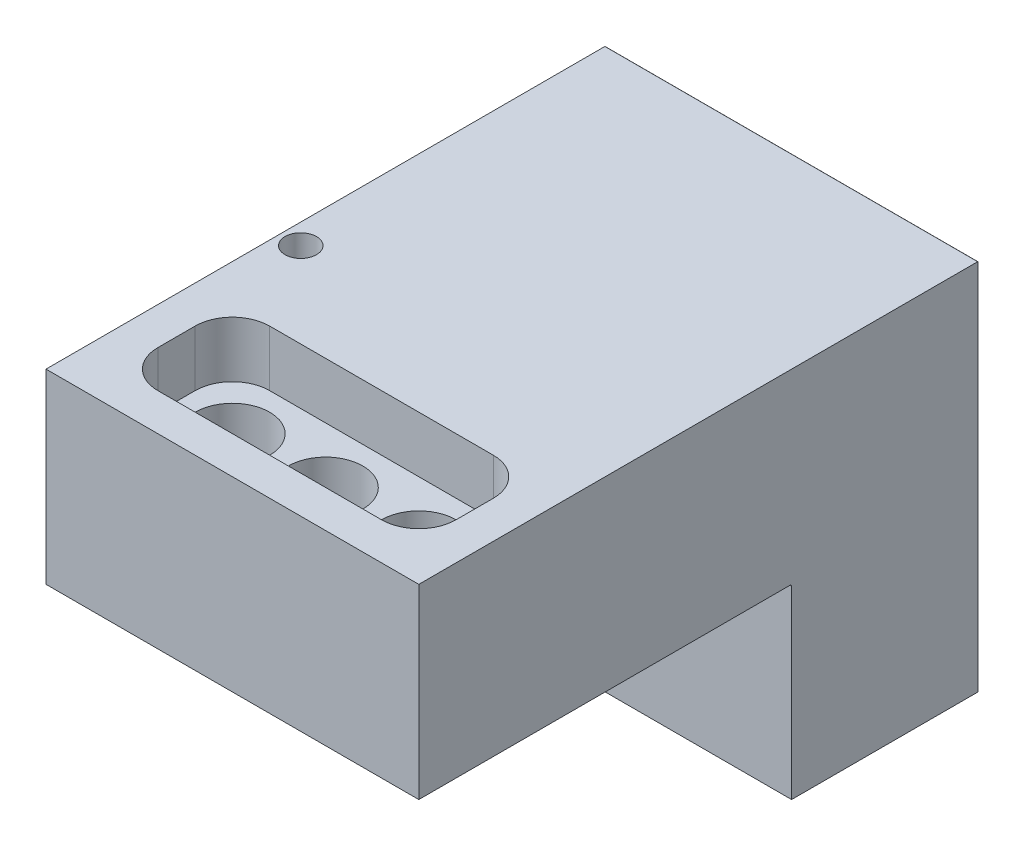
ISO-10303-21;
HEADER;
FILE_DESCRIPTION(('STEP AP214'),'2;1');
FILE_NAME('part.step','',(''),(''),'','','');
FILE_SCHEMA(('AUTOMOTIVE_DESIGN { 1 0 10303 214 1 1 1 1 }'));
ENDSEC;
DATA;
#1=APPLICATION_CONTEXT('core data for automotive mechanical design processes');
#2=APPLICATION_PROTOCOL_DEFINITION('international standard','automotive_design',2000,#1);
#3=PRODUCT_CONTEXT('',#1,'mechanical');
#4=PRODUCT('Part','Part','',(#3));
#5=PRODUCT_RELATED_PRODUCT_CATEGORY('part','',(#4));
#6=PRODUCT_DEFINITION_FORMATION('','',#4);
#7=PRODUCT_DEFINITION_CONTEXT('part definition',#1,'design');
#8=PRODUCT_DEFINITION('design','',#6,#7);
#9=PRODUCT_DEFINITION_SHAPE('','',#8);
#10=(LENGTH_UNIT() NAMED_UNIT(*) SI_UNIT(.MILLI.,.METRE.));
#11=(NAMED_UNIT(*) PLANE_ANGLE_UNIT() SI_UNIT($,.RADIAN.));
#12=(NAMED_UNIT(*) SI_UNIT($,.STERADIAN.) SOLID_ANGLE_UNIT());
#13=UNCERTAINTY_MEASURE_WITH_UNIT(LENGTH_MEASURE(1.E-05),#10,'distance_accuracy_value','');
#14=(GEOMETRIC_REPRESENTATION_CONTEXT(3) GLOBAL_UNCERTAINTY_ASSIGNED_CONTEXT((#13)) GLOBAL_UNIT_ASSIGNED_CONTEXT((#10,
#11,#12)) REPRESENTATION_CONTEXT('',''));
#15=CARTESIAN_POINT('',(0.,0.,0.));
#16=DIRECTION('',(0.,0.,1.));
#17=DIRECTION('',(1.,0.,0.));
#18=AXIS2_PLACEMENT_3D('',#15,#16,#17);
#19=CARTESIAN_POINT('',(0.,50.,0.));
#20=DIRECTION('',(1.,0.,0.));
#21=DIRECTION('',(0.,0.,-1.));
#22=AXIS2_PLACEMENT_3D('',#19,#20,#21);
#23=PLANE('',#22);
#24=DIRECTION('',(0.,0.,1.));
#25=VECTOR('',#24,1.);
#26=CARTESIAN_POINT('',(0.,50.,0.));
#27=LINE('',#26,#25);
#28=CARTESIAN_POINT('',(0.,50.,-149.9));
#29=VERTEX_POINT('',#28);
#30=CARTESIAN_POINT('',(0.,50.,0.));
#31=VERTEX_POINT('',#30);
#32=EDGE_CURVE('E217',#29,#31,#27,.T.);
#33=ORIENTED_EDGE('',*,*,#32,.F.);
#34=CARTESIAN_POINT('',(0.,49.9,-149.9));
#35=DIRECTION('',(1.,0.,0.));
#36=DIRECTION('',(0.,0.,-1.));
#37=AXIS2_PLACEMENT_3D('',#34,#35,#36);
#38=CIRCLE('',#37,0.1);
#39=CARTESIAN_POINT('',(0.,49.9,-150.));
#40=VERTEX_POINT('',#39);
#41=EDGE_CURVE('E278',#29,#40,#38,.F.);
#42=ORIENTED_EDGE('',*,*,#41,.T.);
#43=DIRECTION('',(0.,1.,0.));
#44=VECTOR('',#43,1.);
#45=CARTESIAN_POINT('',(0.,-50.,-150.));
#46=LINE('',#45,#44);
#47=CARTESIAN_POINT('',(0.,-50.,-150.));
#48=VERTEX_POINT('',#47);
#49=EDGE_CURVE('E174',#48,#40,#46,.T.);
#50=ORIENTED_EDGE('',*,*,#49,.F.);
#51=DIRECTION('',(0.,0.,-1.));
#52=VECTOR('',#51,1.);
#53=CARTESIAN_POINT('',(0.,-50.,-100.));
#54=LINE('',#53,#52);
#55=CARTESIAN_POINT('',(0.,-50.,-100.));
#56=VERTEX_POINT('',#55);
#57=EDGE_CURVE('E155',#56,#48,#54,.T.);
#58=ORIENTED_EDGE('',*,*,#57,.F.);
#59=DIRECTION('',(0.,1.,0.));
#60=VECTOR('',#59,1.);
#61=CARTESIAN_POINT('',(0.,-50.,-100.));
#62=LINE('',#61,#60);
#63=CARTESIAN_POINT('',(0.,-0.500000000000014,-100.));
#64=VERTEX_POINT('',#63);
#65=EDGE_CURVE('E152',#56,#64,#62,.T.);
#66=ORIENTED_EDGE('',*,*,#65,.T.);
#67=CARTESIAN_POINT('',(0.,-0.5,-99.5));
#68=DIRECTION('',(1.,0.,0.));
#69=DIRECTION('',(0.,0.,-1.));
#70=AXIS2_PLACEMENT_3D('',#67,#68,#69);
#71=CIRCLE('',#70,0.5);
#72=CARTESIAN_POINT('',(0.,0.,-99.5));
#73=VERTEX_POINT('',#72);
#74=EDGE_CURVE('E41',#64,#73,#71,.T.);
#75=ORIENTED_EDGE('',*,*,#74,.T.);
#76=DIRECTION('',(0.,0.,1.));
#77=VECTOR('',#76,1.);
#78=CARTESIAN_POINT('',(0.,0.,0.));
#79=LINE('',#78,#77);
#80=CARTESIAN_POINT('',(0.,0.,0.));
#81=VERTEX_POINT('',#80);
#82=EDGE_CURVE('E206',#73,#81,#79,.T.);
#83=ORIENTED_EDGE('',*,*,#82,.T.);
#84=DIRECTION('',(0.,-1.,0.));
#85=VECTOR('',#84,1.);
#86=CARTESIAN_POINT('',(0.,50.,0.));
#87=LINE('',#86,#85);
#88=EDGE_CURVE('E232',#31,#81,#87,.T.);
#89=ORIENTED_EDGE('',*,*,#88,.F.);
#90=EDGE_LOOP('',(#33,#42,#50,#58,#66,#75,#83,#89));
#91=FACE_BOUND('',#90,.T.);
#92=ADVANCED_FACE('F33',(#91),#23,.F.);
#93=CARTESIAN_POINT('',(0.,50.,0.));
#94=DIRECTION('',(0.,0.,-1.));
#95=DIRECTION('',(-1.,0.,0.));
#96=AXIS2_PLACEMENT_3D('',#93,#94,#95);
#97=PLANE('',#96);
#98=DIRECTION('',(1.,0.,0.));
#99=VECTOR('',#98,1.);
#100=CARTESIAN_POINT('',(0.,0.,0.));
#101=LINE('',#100,#99);
#102=CARTESIAN_POINT('',(100.,0.,0.));
#103=VERTEX_POINT('',#102);
#104=EDGE_CURVE('E227',#81,#103,#101,.T.);
#105=ORIENTED_EDGE('',*,*,#104,.T.);
#106=DIRECTION('',(0.,-1.,0.));
#107=VECTOR('',#106,1.);
#108=CARTESIAN_POINT('',(100.,50.,0.));
#109=LINE('',#108,#107);
#110=CARTESIAN_POINT('',(100.,50.,0.));
#111=VERTEX_POINT('',#110);
#112=EDGE_CURVE('E225',#111,#103,#109,.T.);
#113=ORIENTED_EDGE('',*,*,#112,.F.);
#114=DIRECTION('',(1.,0.,0.));
#115=VECTOR('',#114,1.);
#116=CARTESIAN_POINT('',(0.,50.,0.));
#117=LINE('',#116,#115);
#118=EDGE_CURVE('E219',#31,#111,#117,.T.);
#119=ORIENTED_EDGE('',*,*,#118,.F.);
#120=ORIENTED_EDGE('',*,*,#88,.T.);
#121=EDGE_LOOP('',(#105,#113,#119,#120));
#122=FACE_BOUND('',#121,.T.);
#123=ADVANCED_FACE('F307',(#122),#97,.F.);
#124=CARTESIAN_POINT('',(100.,50.,0.));
#125=DIRECTION('',(-1.,0.,0.));
#126=DIRECTION('',(0.,0.,1.));
#127=AXIS2_PLACEMENT_3D('',#124,#125,#126);
#128=PLANE('',#127);
#129=DIRECTION('',(0.,1.,0.));
#130=VECTOR('',#129,1.);
#131=CARTESIAN_POINT('',(100.,-50.,-150.));
#132=LINE('',#131,#130);
#133=CARTESIAN_POINT('',(100.,-50.,-150.));
#134=VERTEX_POINT('',#133);
#135=CARTESIAN_POINT('',(100.,49.9,-150.));
#136=VERTEX_POINT('',#135);
#137=EDGE_CURVE('E290',#134,#136,#132,.T.);
#138=ORIENTED_EDGE('',*,*,#137,.T.);
#139=CARTESIAN_POINT('',(100.,49.9,-149.9));
#140=DIRECTION('',(-1.,0.,0.));
#141=DIRECTION('',(0.,0.,1.));
#142=AXIS2_PLACEMENT_3D('',#139,#140,#141);
#143=CIRCLE('',#142,0.1);
#144=CARTESIAN_POINT('',(100.,50.,-149.9));
#145=VERTEX_POINT('',#144);
#146=EDGE_CURVE('E274',#136,#145,#143,.F.);
#147=ORIENTED_EDGE('',*,*,#146,.T.);
#148=DIRECTION('',(0.,0.,-1.));
#149=VECTOR('',#148,1.);
#150=CARTESIAN_POINT('',(100.,50.,0.));
#151=LINE('',#150,#149);
#152=EDGE_CURVE('E222',#111,#145,#151,.T.);
#153=ORIENTED_EDGE('',*,*,#152,.F.);
#154=ORIENTED_EDGE('',*,*,#112,.T.);
#155=DIRECTION('',(0.,0.,-1.));
#156=VECTOR('',#155,1.);
#157=CARTESIAN_POINT('',(100.,0.,0.));
#158=LINE('',#157,#156);
#159=CARTESIAN_POINT('',(100.,0.,-99.5));
#160=VERTEX_POINT('',#159);
#161=EDGE_CURVE('E220',#103,#160,#158,.T.);
#162=ORIENTED_EDGE('',*,*,#161,.T.);
#163=CARTESIAN_POINT('',(100.,-0.5,-99.5));
#164=DIRECTION('',(-1.,0.,0.));
#165=DIRECTION('',(0.,0.,1.));
#166=AXIS2_PLACEMENT_3D('',#163,#164,#165);
#167=CIRCLE('',#166,0.5);
#168=CARTESIAN_POINT('',(100.,-0.500000000000014,-100.));
#169=VERTEX_POINT('',#168);
#170=EDGE_CURVE('E11',#160,#169,#167,.T.);
#171=ORIENTED_EDGE('',*,*,#170,.T.);
#172=DIRECTION('',(0.,1.,0.));
#173=VECTOR('',#172,1.);
#174=CARTESIAN_POINT('',(100.,-50.,-100.));
#175=LINE('',#174,#173);
#176=CARTESIAN_POINT('',(100.,-50.,-100.));
#177=VERTEX_POINT('',#176);
#178=EDGE_CURVE('E150',#177,#169,#175,.T.);
#179=ORIENTED_EDGE('',*,*,#178,.F.);
#180=DIRECTION('',(0.,0.,1.));
#181=VECTOR('',#180,1.);
#182=CARTESIAN_POINT('',(100.,-50.,-100.));
#183=LINE('',#182,#181);
#184=EDGE_CURVE('E156',#134,#177,#183,.T.);
#185=ORIENTED_EDGE('',*,*,#184,.F.);
#186=EDGE_LOOP('',(#138,#147,#153,#154,#162,#171,#179,#185));
#187=FACE_BOUND('',#186,.T.);
#188=ADVANCED_FACE('F167',(#187),#128,.F.);
#189=CARTESIAN_POINT('',(0.,50.,0.));
#190=DIRECTION('',(0.,-1.,0.));
#191=DIRECTION('',(0.,0.,-1.));
#192=AXIS2_PLACEMENT_3D('',#189,#190,#191);
#193=PLANE('',#192);
#194=CARTESIAN_POINT('',(5.48038134779816,50.,-62.8541303858547));
#195=DIRECTION('',(0.,1.,0.));
#196=DIRECTION('',(0.,0.,1.));
#197=AXIS2_PLACEMENT_3D('',#194,#195,#196);
#198=CIRCLE('',#197,4.22466499857533);
#199=CARTESIAN_POINT('',(5.48038134779816,50.,-58.6294653872794));
#200=VERTEX_POINT('',#199);
#201=EDGE_CURVE('E283',#200,#200,#198,.T.);
#202=ORIENTED_EDGE('',*,*,#201,.F.);
#203=EDGE_LOOP('',(#202));
#204=FACE_BOUND('',#203,.T.);
#205=DIRECTION('',(1.,0.,0.));
#206=VECTOR('',#205,1.);
#207=CARTESIAN_POINT('',(10.,50.,-10.));
#208=LINE('',#207,#206);
#209=CARTESIAN_POINT('',(20.,50.,-10.));
#210=VERTEX_POINT('',#209);
#211=CARTESIAN_POINT('',(80.,50.,-10.));
#212=VERTEX_POINT('',#211);
#213=EDGE_CURVE('E209',#210,#212,#208,.T.);
#214=ORIENTED_EDGE('',*,*,#213,.F.);
#215=CARTESIAN_POINT('',(20.,50.,-20.));
#216=DIRECTION('',(0.,-1.,0.));
#217=DIRECTION('',(0.,0.,-1.));
#218=AXIS2_PLACEMENT_3D('',#215,#216,#217);
#219=CIRCLE('',#218,10.);
#220=CARTESIAN_POINT('',(10.,50.,-20.));
#221=VERTEX_POINT('',#220);
#222=EDGE_CURVE('E269',#210,#221,#219,.T.);
#223=ORIENTED_EDGE('',*,*,#222,.T.);
#224=DIRECTION('',(0.,0.,1.));
#225=VECTOR('',#224,1.);
#226=CARTESIAN_POINT('',(10.,50.,-10.));
#227=LINE('',#226,#225);
#228=CARTESIAN_POINT('',(10.,50.,-30.));
#229=VERTEX_POINT('',#228);
#230=EDGE_CURVE('E184',#229,#221,#227,.T.);
#231=ORIENTED_EDGE('',*,*,#230,.F.);
#232=CARTESIAN_POINT('',(20.,50.,-30.));
#233=DIRECTION('',(0.,-1.,0.));
#234=DIRECTION('',(0.,0.,-1.));
#235=AXIS2_PLACEMENT_3D('',#232,#233,#234);
#236=CIRCLE('',#235,10.);
#237=CARTESIAN_POINT('',(20.,50.,-40.));
#238=VERTEX_POINT('',#237);
#239=EDGE_CURVE('E267',#229,#238,#236,.T.);
#240=ORIENTED_EDGE('',*,*,#239,.T.);
#241=DIRECTION('',(-1.,0.,0.));
#242=VECTOR('',#241,1.);
#243=CARTESIAN_POINT('',(10.,50.,-40.));
#244=LINE('',#243,#242);
#245=CARTESIAN_POINT('',(80.,50.,-40.));
#246=VERTEX_POINT('',#245);
#247=EDGE_CURVE('E197',#246,#238,#244,.T.);
#248=ORIENTED_EDGE('',*,*,#247,.F.);
#249=CARTESIAN_POINT('',(80.,50.,-30.));
#250=DIRECTION('',(0.,-1.,0.));
#251=DIRECTION('',(0.,0.,-1.));
#252=AXIS2_PLACEMENT_3D('',#249,#250,#251);
#253=CIRCLE('',#252,10.);
#254=CARTESIAN_POINT('',(90.,50.,-30.));
#255=VERTEX_POINT('',#254);
#256=EDGE_CURVE('E265',#246,#255,#253,.T.);
#257=ORIENTED_EDGE('',*,*,#256,.T.);
#258=DIRECTION('',(0.,0.,-1.));
#259=VECTOR('',#258,1.);
#260=CARTESIAN_POINT('',(90.,50.,-10.));
#261=LINE('',#260,#259);
#262=CARTESIAN_POINT('',(90.,50.,-20.));
#263=VERTEX_POINT('',#262);
#264=EDGE_CURVE('E212',#263,#255,#261,.T.);
#265=ORIENTED_EDGE('',*,*,#264,.F.);
#266=CARTESIAN_POINT('',(80.,50.,-20.));
#267=DIRECTION('',(0.,-1.,0.));
#268=DIRECTION('',(0.,0.,-1.));
#269=AXIS2_PLACEMENT_3D('',#266,#267,#268);
#270=CIRCLE('',#269,10.);
#271=EDGE_CURVE('E263',#263,#212,#270,.T.);
#272=ORIENTED_EDGE('',*,*,#271,.T.);
#273=EDGE_LOOP('',(#214,#223,#231,#240,#248,#257,#265,#272));
#274=FACE_BOUND('',#273,.T.);
#275=ORIENTED_EDGE('',*,*,#152,.T.);
#276=DIRECTION('',(1.,0.,0.));
#277=VECTOR('',#276,1.);
#278=CARTESIAN_POINT('',(0.,50.,-149.9));
#279=LINE('',#278,#277);
#280=EDGE_CURVE('E276',#145,#29,#279,.F.);
#281=ORIENTED_EDGE('',*,*,#280,.T.);
#282=ORIENTED_EDGE('',*,*,#32,.T.);
#283=ORIENTED_EDGE('',*,*,#118,.T.);
#284=EDGE_LOOP('',(#275,#281,#282,#283));
#285=FACE_BOUND('',#284,.T.);
#286=ADVANCED_FACE('F302',(#204,#274,#285),#193,.F.);
#287=CARTESIAN_POINT('',(0.,0.,0.));
#288=DIRECTION('',(0.,-1.,0.));
#289=DIRECTION('',(0.,0.,-1.));
#290=AXIS2_PLACEMENT_3D('',#287,#288,#289);
#291=PLANE('',#290);
#292=CARTESIAN_POINT('',(5.48038134779816,0.,-62.8541303858547));
#293=DIRECTION('',(0.,-1.,0.));
#294=DIRECTION('',(0.,0.,-1.));
#295=AXIS2_PLACEMENT_3D('',#292,#293,#294);
#296=CIRCLE('',#295,4.22466499857533);
#297=CARTESIAN_POINT('',(5.48038134779816,0.,-67.0787953844301));
#298=VERTEX_POINT('',#297);
#299=EDGE_CURVE('E165',#298,#298,#296,.T.);
#300=ORIENTED_EDGE('',*,*,#299,.F.);
#301=EDGE_LOOP('',(#300));
#302=FACE_BOUND('',#301,.T.);
#303=CARTESIAN_POINT('',(50.,0.,-25.));
#304=DIRECTION('',(0.,1.,0.));
#305=DIRECTION('',(0.,0.,1.));
#306=AXIS2_PLACEMENT_3D('',#303,#304,#305);
#307=CIRCLE('',#306,10.);
#308=CARTESIAN_POINT('',(50.,0.,-15.));
#309=VERTEX_POINT('',#308);
#310=EDGE_CURVE('E172',#309,#309,#307,.T.);
#311=ORIENTED_EDGE('',*,*,#310,.T.);
#312=EDGE_LOOP('',(#311));
#313=FACE_BOUND('',#312,.T.);
#314=ORIENTED_EDGE('',*,*,#82,.F.);
#315=DIRECTION('',(-1.,0.,0.));
#316=VECTOR('',#315,1.);
#317=CARTESIAN_POINT('',(0.,0.,-99.5));
#318=LINE('',#317,#316);
#319=EDGE_CURVE('E48',#73,#160,#318,.F.);
#320=ORIENTED_EDGE('',*,*,#319,.T.);
#321=ORIENTED_EDGE('',*,*,#161,.F.);
#322=ORIENTED_EDGE('',*,*,#104,.F.);
#323=EDGE_LOOP('',(#314,#320,#321,#322));
#324=FACE_BOUND('',#323,.T.);
#325=ADVANCED_FACE('F309',(#302,#313,#324),#291,.T.);
#326=CARTESIAN_POINT('',(10.,35.,-10.));
#327=DIRECTION('',(-1.,0.,0.));
#328=DIRECTION('',(0.,0.,1.));
#329=AXIS2_PLACEMENT_3D('',#326,#327,#328);
#330=PLANE('',#329);
#331=DIRECTION('',(0.,0.,1.));
#332=VECTOR('',#331,1.);
#333=CARTESIAN_POINT('',(10.,35.,-10.));
#334=LINE('',#333,#332);
#335=CARTESIAN_POINT('',(10.,35.,-30.));
#336=VERTEX_POINT('',#335);
#337=CARTESIAN_POINT('',(10.,35.,-20.));
#338=VERTEX_POINT('',#337);
#339=EDGE_CURVE('E193',#336,#338,#334,.T.);
#340=ORIENTED_EDGE('',*,*,#339,.F.);
#341=DIRECTION('',(0.,1.,0.));
#342=VECTOR('',#341,1.);
#343=CARTESIAN_POINT('',(10.,50.,-30.));
#344=LINE('',#343,#342);
#345=EDGE_CURVE('E260',#336,#229,#344,.T.);
#346=ORIENTED_EDGE('',*,*,#345,.T.);
#347=ORIENTED_EDGE('',*,*,#230,.T.);
#348=DIRECTION('',(0.,1.,0.));
#349=VECTOR('',#348,1.);
#350=CARTESIAN_POINT('',(10.,35.,-20.));
#351=LINE('',#350,#349);
#352=EDGE_CURVE('E258',#221,#338,#351,.F.);
#353=ORIENTED_EDGE('',*,*,#352,.T.);
#354=EDGE_LOOP('',(#340,#346,#347,#353));
#355=FACE_BOUND('',#354,.T.);
#356=ADVANCED_FACE('F382',(#355),#330,.F.);
#357=CARTESIAN_POINT('',(10.,35.,-40.));
#358=DIRECTION('',(0.,0.,-1.));
#359=DIRECTION('',(-1.,0.,0.));
#360=AXIS2_PLACEMENT_3D('',#357,#358,#359);
#361=PLANE('',#360);
#362=DIRECTION('',(-1.,0.,0.));
#363=VECTOR('',#362,1.);
#364=CARTESIAN_POINT('',(10.,35.,-40.));
#365=LINE('',#364,#363);
#366=CARTESIAN_POINT('',(80.,35.,-40.));
#367=VERTEX_POINT('',#366);
#368=CARTESIAN_POINT('',(20.,35.,-40.));
#369=VERTEX_POINT('',#368);
#370=EDGE_CURVE('E203',#367,#369,#365,.T.);
#371=ORIENTED_EDGE('',*,*,#370,.F.);
#372=DIRECTION('',(0.,1.,0.));
#373=VECTOR('',#372,1.);
#374=CARTESIAN_POINT('',(80.,50.,-40.));
#375=LINE('',#374,#373);
#376=EDGE_CURVE('E255',#367,#246,#375,.T.);
#377=ORIENTED_EDGE('',*,*,#376,.T.);
#378=ORIENTED_EDGE('',*,*,#247,.T.);
#379=DIRECTION('',(0.,1.,0.));
#380=VECTOR('',#379,1.);
#381=CARTESIAN_POINT('',(20.,35.,-40.));
#382=LINE('',#381,#380);
#383=EDGE_CURVE('E253',#238,#369,#382,.F.);
#384=ORIENTED_EDGE('',*,*,#383,.T.);
#385=EDGE_LOOP('',(#371,#377,#378,#384));
#386=FACE_BOUND('',#385,.T.);
#387=ADVANCED_FACE('F378',(#386),#361,.F.);
#388=CARTESIAN_POINT('',(90.,35.,-10.));
#389=DIRECTION('',(1.,0.,0.));
#390=DIRECTION('',(0.,0.,-1.));
#391=AXIS2_PLACEMENT_3D('',#388,#389,#390);
#392=PLANE('',#391);
#393=DIRECTION('',(0.,0.,-1.));
#394=VECTOR('',#393,1.);
#395=CARTESIAN_POINT('',(90.,35.,-10.));
#396=LINE('',#395,#394);
#397=CARTESIAN_POINT('',(90.,35.,-20.));
#398=VERTEX_POINT('',#397);
#399=CARTESIAN_POINT('',(90.,35.,-30.));
#400=VERTEX_POINT('',#399);
#401=EDGE_CURVE('E200',#398,#400,#396,.T.);
#402=ORIENTED_EDGE('',*,*,#401,.F.);
#403=DIRECTION('',(0.,1.,0.));
#404=VECTOR('',#403,1.);
#405=CARTESIAN_POINT('',(90.,50.,-20.));
#406=LINE('',#405,#404);
#407=EDGE_CURVE('E237',#398,#263,#406,.T.);
#408=ORIENTED_EDGE('',*,*,#407,.T.);
#409=ORIENTED_EDGE('',*,*,#264,.T.);
#410=DIRECTION('',(0.,1.,0.));
#411=VECTOR('',#410,1.);
#412=CARTESIAN_POINT('',(90.,35.,-30.));
#413=LINE('',#412,#411);
#414=EDGE_CURVE('E235',#255,#400,#413,.F.);
#415=ORIENTED_EDGE('',*,*,#414,.T.);
#416=EDGE_LOOP('',(#402,#408,#409,#415));
#417=FACE_BOUND('',#416,.T.);
#418=ADVANCED_FACE('F381',(#417),#392,.F.);
#419=CARTESIAN_POINT('',(10.,35.,-10.));
#420=DIRECTION('',(0.,0.,1.));
#421=DIRECTION('',(1.,0.,0.));
#422=AXIS2_PLACEMENT_3D('',#419,#420,#421);
#423=PLANE('',#422);
#424=ORIENTED_EDGE('',*,*,#213,.T.);
#425=DIRECTION('',(0.,1.,0.));
#426=VECTOR('',#425,1.);
#427=CARTESIAN_POINT('',(80.,35.,-10.));
#428=LINE('',#427,#426);
#429=CARTESIAN_POINT('',(80.,35.,-10.));
#430=VERTEX_POINT('',#429);
#431=EDGE_CURVE('E243',#212,#430,#428,.F.);
#432=ORIENTED_EDGE('',*,*,#431,.T.);
#433=DIRECTION('',(1.,0.,0.));
#434=VECTOR('',#433,1.);
#435=CARTESIAN_POINT('',(10.,35.,-10.));
#436=LINE('',#435,#434);
#437=CARTESIAN_POINT('',(20.,35.,-10.));
#438=VERTEX_POINT('',#437);
#439=EDGE_CURVE('E196',#438,#430,#436,.T.);
#440=ORIENTED_EDGE('',*,*,#439,.F.);
#441=DIRECTION('',(0.,1.,0.));
#442=VECTOR('',#441,1.);
#443=CARTESIAN_POINT('',(20.,50.,-10.));
#444=LINE('',#443,#442);
#445=EDGE_CURVE('E240',#438,#210,#444,.T.);
#446=ORIENTED_EDGE('',*,*,#445,.T.);
#447=EDGE_LOOP('',(#424,#432,#440,#446));
#448=FACE_BOUND('',#447,.T.);
#449=ADVANCED_FACE('F376',(#448),#423,.F.);
#450=CARTESIAN_POINT('',(0.,35.,0.));
#451=DIRECTION('',(0.,-1.,0.));
#452=DIRECTION('',(0.,0.,-1.));
#453=AXIS2_PLACEMENT_3D('',#450,#451,#452);
#454=PLANE('',#453);
#455=CARTESIAN_POINT('',(50.,35.,-25.));
#456=DIRECTION('',(0.,1.,0.));
#457=DIRECTION('',(0.,0.,1.));
#458=AXIS2_PLACEMENT_3D('',#455,#456,#457);
#459=CIRCLE('',#458,10.);
#460=CARTESIAN_POINT('',(50.,35.,-15.));
#461=VERTEX_POINT('',#460);
#462=EDGE_CURVE('E169',#461,#461,#459,.T.);
#463=ORIENTED_EDGE('',*,*,#462,.F.);
#464=EDGE_LOOP('',(#463));
#465=FACE_BOUND('',#464,.T.);
#466=CARTESIAN_POINT('',(25.,35.,-25.));
#467=DIRECTION('',(0.,1.,0.));
#468=DIRECTION('',(0.,0.,1.));
#469=AXIS2_PLACEMENT_3D('',#466,#467,#468);
#470=CIRCLE('',#469,10.);
#471=CARTESIAN_POINT('',(25.,35.,-15.));
#472=VERTEX_POINT('',#471);
#473=EDGE_CURVE('E185',#472,#472,#470,.T.);
#474=ORIENTED_EDGE('',*,*,#473,.F.);
#475=EDGE_LOOP('',(#474));
#476=FACE_BOUND('',#475,.T.);
#477=CARTESIAN_POINT('',(75.,35.,-25.));
#478=DIRECTION('',(0.,1.,0.));
#479=DIRECTION('',(0.,0.,1.));
#480=AXIS2_PLACEMENT_3D('',#477,#478,#479);
#481=CIRCLE('',#480,9.99999999999999);
#482=CARTESIAN_POINT('',(75.,35.,-15.));
#483=VERTEX_POINT('',#482);
#484=EDGE_CURVE('E179',#483,#483,#481,.T.);
#485=ORIENTED_EDGE('',*,*,#484,.F.);
#486=EDGE_LOOP('',(#485));
#487=FACE_BOUND('',#486,.T.);
#488=ORIENTED_EDGE('',*,*,#439,.T.);
#489=CARTESIAN_POINT('',(80.,35.,-20.));
#490=DIRECTION('',(0.,-1.,0.));
#491=DIRECTION('',(0.,0.,-1.));
#492=AXIS2_PLACEMENT_3D('',#489,#490,#491);
#493=CIRCLE('',#492,10.);
#494=EDGE_CURVE('E251',#430,#398,#493,.F.);
#495=ORIENTED_EDGE('',*,*,#494,.T.);
#496=ORIENTED_EDGE('',*,*,#401,.T.);
#497=CARTESIAN_POINT('',(80.,35.,-30.));
#498=DIRECTION('',(0.,-1.,0.));
#499=DIRECTION('',(0.,0.,-1.));
#500=AXIS2_PLACEMENT_3D('',#497,#498,#499);
#501=CIRCLE('',#500,10.);
#502=EDGE_CURVE('E249',#400,#367,#501,.F.);
#503=ORIENTED_EDGE('',*,*,#502,.T.);
#504=ORIENTED_EDGE('',*,*,#370,.T.);
#505=CARTESIAN_POINT('',(20.,35.,-30.));
#506=DIRECTION('',(0.,-1.,0.));
#507=DIRECTION('',(0.,0.,-1.));
#508=AXIS2_PLACEMENT_3D('',#505,#506,#507);
#509=CIRCLE('',#508,10.);
#510=EDGE_CURVE('E247',#369,#336,#509,.F.);
#511=ORIENTED_EDGE('',*,*,#510,.T.);
#512=ORIENTED_EDGE('',*,*,#339,.T.);
#513=CARTESIAN_POINT('',(20.,35.,-20.));
#514=DIRECTION('',(0.,-1.,0.));
#515=DIRECTION('',(0.,0.,-1.));
#516=AXIS2_PLACEMENT_3D('',#513,#514,#515);
#517=CIRCLE('',#516,10.);
#518=EDGE_CURVE('E245',#338,#438,#517,.F.);
#519=ORIENTED_EDGE('',*,*,#518,.T.);
#520=EDGE_LOOP('',(#488,#495,#496,#503,#504,#511,#512,#519));
#521=FACE_BOUND('',#520,.T.);
#522=ADVANCED_FACE('F331',(#465,#476,#487,#521),#454,.F.);
#523=CARTESIAN_POINT('',(80.,35.,-20.));
#524=DIRECTION('',(0.,-1.,0.));
#525=DIRECTION('',(0.,0.,-1.));
#526=AXIS2_PLACEMENT_3D('',#523,#524,#525);
#527=CYLINDRICAL_SURFACE('',#526,10.);
#528=ORIENTED_EDGE('',*,*,#494,.F.);
#529=ORIENTED_EDGE('',*,*,#431,.F.);
#530=ORIENTED_EDGE('',*,*,#271,.F.);
#531=ORIENTED_EDGE('',*,*,#407,.F.);
#532=EDGE_LOOP('',(#528,#529,#530,#531));
#533=FACE_BOUND('',#532,.T.);
#534=ADVANCED_FACE('F327',(#533),#527,.F.);
#535=CARTESIAN_POINT('',(80.,35.,-30.));
#536=DIRECTION('',(0.,-1.,0.));
#537=DIRECTION('',(0.,0.,-1.));
#538=AXIS2_PLACEMENT_3D('',#535,#536,#537);
#539=CYLINDRICAL_SURFACE('',#538,10.);
#540=ORIENTED_EDGE('',*,*,#502,.F.);
#541=ORIENTED_EDGE('',*,*,#414,.F.);
#542=ORIENTED_EDGE('',*,*,#256,.F.);
#543=ORIENTED_EDGE('',*,*,#376,.F.);
#544=EDGE_LOOP('',(#540,#541,#542,#543));
#545=FACE_BOUND('',#544,.T.);
#546=ADVANCED_FACE('F330',(#545),#539,.F.);
#547=CARTESIAN_POINT('',(20.,35.,-30.));
#548=DIRECTION('',(0.,-1.,0.));
#549=DIRECTION('',(0.,0.,-1.));
#550=AXIS2_PLACEMENT_3D('',#547,#548,#549);
#551=CYLINDRICAL_SURFACE('',#550,10.);
#552=ORIENTED_EDGE('',*,*,#510,.F.);
#553=ORIENTED_EDGE('',*,*,#383,.F.);
#554=ORIENTED_EDGE('',*,*,#239,.F.);
#555=ORIENTED_EDGE('',*,*,#345,.F.);
#556=EDGE_LOOP('',(#552,#553,#554,#555));
#557=FACE_BOUND('',#556,.T.);
#558=ADVANCED_FACE('F335',(#557),#551,.F.);
#559=CARTESIAN_POINT('',(20.,35.,-20.));
#560=DIRECTION('',(0.,-1.,0.));
#561=DIRECTION('',(0.,0.,-1.));
#562=AXIS2_PLACEMENT_3D('',#559,#560,#561);
#563=CYLINDRICAL_SURFACE('',#562,10.);
#564=ORIENTED_EDGE('',*,*,#518,.F.);
#565=ORIENTED_EDGE('',*,*,#352,.F.);
#566=ORIENTED_EDGE('',*,*,#222,.F.);
#567=ORIENTED_EDGE('',*,*,#445,.F.);
#568=EDGE_LOOP('',(#564,#565,#566,#567));
#569=FACE_BOUND('',#568,.T.);
#570=ADVANCED_FACE('F339',(#569),#563,.F.);
#571=CARTESIAN_POINT('',(75.,20.,-25.));
#572=DIRECTION('',(0.,1.,0.));
#573=DIRECTION('',(0.,0.,1.));
#574=AXIS2_PLACEMENT_3D('',#571,#572,#573);
#575=CYLINDRICAL_SURFACE('',#574,9.99999999999999);
#576=CARTESIAN_POINT('',(75.,20.,-25.));
#577=DIRECTION('',(0.,1.,0.));
#578=DIRECTION('',(0.,0.,1.));
#579=AXIS2_PLACEMENT_3D('',#576,#577,#578);
#580=CIRCLE('',#579,9.99999999999999);
#581=CARTESIAN_POINT('',(75.,20.,-15.));
#582=VERTEX_POINT('',#581);
#583=EDGE_CURVE('E188',#582,#582,#580,.T.);
#584=ORIENTED_EDGE('',*,*,#583,.F.);
#585=EDGE_LOOP('',(#584));
#586=FACE_BOUND('',#585,.T.);
#587=ORIENTED_EDGE('',*,*,#484,.T.);
#588=EDGE_LOOP('',(#587));
#589=FACE_BOUND('',#588,.T.);
#590=ADVANCED_FACE('F342',(#586,#589),#575,.F.);
#591=CARTESIAN_POINT('',(75.,20.,-25.));
#592=DIRECTION('',(0.,1.,0.));
#593=DIRECTION('',(0.,0.,1.));
#594=AXIS2_PLACEMENT_3D('',#591,#592,#593);
#595=PLANE('',#594);
#596=ORIENTED_EDGE('',*,*,#583,.T.);
#597=EDGE_LOOP('',(#596));
#598=FACE_BOUND('',#597,.T.);
#599=ADVANCED_FACE('F366',(#598),#595,.T.);
#600=CARTESIAN_POINT('',(25.,20.,-25.));
#601=DIRECTION('',(0.,1.,0.));
#602=DIRECTION('',(0.,0.,1.));
#603=AXIS2_PLACEMENT_3D('',#600,#601,#602);
#604=CYLINDRICAL_SURFACE('',#603,10.);
#605=CARTESIAN_POINT('',(25.,20.,-25.));
#606=DIRECTION('',(0.,1.,0.));
#607=DIRECTION('',(0.,0.,1.));
#608=AXIS2_PLACEMENT_3D('',#605,#606,#607);
#609=CIRCLE('',#608,10.);
#610=CARTESIAN_POINT('',(25.,20.,-15.));
#611=VERTEX_POINT('',#610);
#612=EDGE_CURVE('E181',#611,#611,#609,.T.);
#613=ORIENTED_EDGE('',*,*,#612,.F.);
#614=EDGE_LOOP('',(#613));
#615=FACE_BOUND('',#614,.T.);
#616=ORIENTED_EDGE('',*,*,#473,.T.);
#617=EDGE_LOOP('',(#616));
#618=FACE_BOUND('',#617,.T.);
#619=ADVANCED_FACE('F362',(#615,#618),#604,.F.);
#620=CARTESIAN_POINT('',(25.,20.,-25.));
#621=DIRECTION('',(0.,1.,0.));
#622=DIRECTION('',(0.,0.,1.));
#623=AXIS2_PLACEMENT_3D('',#620,#621,#622);
#624=PLANE('',#623);
#625=ORIENTED_EDGE('',*,*,#612,.T.);
#626=EDGE_LOOP('',(#625));
#627=FACE_BOUND('',#626,.T.);
#628=ADVANCED_FACE('F358',(#627),#624,.T.);
#629=CARTESIAN_POINT('',(50.,0.,-25.));
#630=DIRECTION('',(0.,1.,0.));
#631=DIRECTION('',(0.,0.,1.));
#632=AXIS2_PLACEMENT_3D('',#629,#630,#631);
#633=CYLINDRICAL_SURFACE('',#632,10.);
#634=ORIENTED_EDGE('',*,*,#310,.F.);
#635=EDGE_LOOP('',(#634));
#636=FACE_BOUND('',#635,.T.);
#637=ORIENTED_EDGE('',*,*,#462,.T.);
#638=EDGE_LOOP('',(#637));
#639=FACE_BOUND('',#638,.T.);
#640=ADVANCED_FACE('F356',(#636,#639),#633,.F.);
#641=CARTESIAN_POINT('',(100.,-50.,-100.));
#642=DIRECTION('',(0.,0.,-1.));
#643=DIRECTION('',(-1.,0.,0.));
#644=AXIS2_PLACEMENT_3D('',#641,#642,#643);
#645=PLANE('',#644);
#646=ORIENTED_EDGE('',*,*,#178,.T.);
#647=DIRECTION('',(-1.,0.,0.));
#648=VECTOR('',#647,1.);
#649=CARTESIAN_POINT('',(100.,-0.5,-100.));
#650=LINE('',#649,#648);
#651=EDGE_CURVE('E280',#169,#64,#650,.T.);
#652=ORIENTED_EDGE('',*,*,#651,.T.);
#653=ORIENTED_EDGE('',*,*,#65,.F.);
#654=DIRECTION('',(-1.,0.,0.));
#655=VECTOR('',#654,1.);
#656=CARTESIAN_POINT('',(100.,-50.,-100.));
#657=LINE('',#656,#655);
#658=EDGE_CURVE('E145',#177,#56,#657,.T.);
#659=ORIENTED_EDGE('',*,*,#658,.F.);
#660=EDGE_LOOP('',(#646,#652,#653,#659));
#661=FACE_BOUND('',#660,.T.);
#662=ADVANCED_FACE('F147',(#661),#645,.F.);
#663=CARTESIAN_POINT('',(100.,-50.,-150.));
#664=DIRECTION('',(0.,0.,1.));
#665=DIRECTION('',(1.,0.,0.));
#666=AXIS2_PLACEMENT_3D('',#663,#664,#665);
#667=PLANE('',#666);
#668=ORIENTED_EDGE('',*,*,#49,.T.);
#669=DIRECTION('',(1.,0.,0.));
#670=VECTOR('',#669,1.);
#671=CARTESIAN_POINT('',(100.,49.9,-150.));
#672=LINE('',#671,#670);
#673=EDGE_CURVE('E271',#40,#136,#672,.T.);
#674=ORIENTED_EDGE('',*,*,#673,.T.);
#675=ORIENTED_EDGE('',*,*,#137,.F.);
#676=DIRECTION('',(1.,0.,0.));
#677=VECTOR('',#676,1.);
#678=CARTESIAN_POINT('',(100.,-50.,-150.));
#679=LINE('',#678,#677);
#680=EDGE_CURVE('E161',#48,#134,#679,.T.);
#681=ORIENTED_EDGE('',*,*,#680,.F.);
#682=EDGE_LOOP('',(#668,#674,#675,#681));
#683=FACE_BOUND('',#682,.T.);
#684=ADVANCED_FACE('F295',(#683),#667,.F.);
#685=CARTESIAN_POINT('',(0.,-50.,0.));
#686=DIRECTION('',(0.,1.,0.));
#687=DIRECTION('',(0.,0.,1.));
#688=AXIS2_PLACEMENT_3D('',#685,#686,#687);
#689=PLANE('',#688);
#690=ORIENTED_EDGE('',*,*,#184,.T.);
#691=ORIENTED_EDGE('',*,*,#658,.T.);
#692=ORIENTED_EDGE('',*,*,#57,.T.);
#693=ORIENTED_EDGE('',*,*,#680,.T.);
#694=EDGE_LOOP('',(#690,#691,#692,#693));
#695=FACE_BOUND('',#694,.T.);
#696=ADVANCED_FACE('F159',(#695),#689,.F.);
#697=CARTESIAN_POINT('',(100.,49.9,-149.9));
#698=DIRECTION('',(1.,0.,0.));
#699=DIRECTION('',(0.,0.,-1.));
#700=AXIS2_PLACEMENT_3D('',#697,#698,#699);
#701=CYLINDRICAL_SURFACE('',#700,0.1);
#702=ORIENTED_EDGE('',*,*,#41,.F.);
#703=ORIENTED_EDGE('',*,*,#280,.F.);
#704=ORIENTED_EDGE('',*,*,#146,.F.);
#705=ORIENTED_EDGE('',*,*,#673,.F.);
#706=EDGE_LOOP('',(#702,#703,#704,#705));
#707=FACE_BOUND('',#706,.T.);
#708=ADVANCED_FACE('F298',(#707),#701,.T.);
#709=CARTESIAN_POINT('',(5.48038134779816,-50.,-62.8541303858547));
#710=DIRECTION('',(0.,1.,0.));
#711=DIRECTION('',(0.,0.,1.));
#712=AXIS2_PLACEMENT_3D('',#709,#710,#711);
#713=CYLINDRICAL_SURFACE('',#712,4.22466499857533);
#714=ORIENTED_EDGE('',*,*,#299,.T.);
#715=EDGE_LOOP('',(#714));
#716=FACE_BOUND('',#715,.T.);
#717=ORIENTED_EDGE('',*,*,#201,.T.);
#718=EDGE_LOOP('',(#717));
#719=FACE_BOUND('',#718,.T.);
#720=ADVANCED_FACE('F311',(#716,#719),#713,.F.);
#721=CARTESIAN_POINT('',(100.,-0.5,-99.5));
#722=DIRECTION('',(-1.,0.,0.));
#723=DIRECTION('',(0.,0.,1.));
#724=AXIS2_PLACEMENT_3D('',#721,#722,#723);
#725=CYLINDRICAL_SURFACE('',#724,0.5);
#726=ORIENTED_EDGE('',*,*,#170,.F.);
#727=ORIENTED_EDGE('',*,*,#319,.F.);
#728=ORIENTED_EDGE('',*,*,#74,.F.);
#729=ORIENTED_EDGE('',*,*,#651,.F.);
#730=EDGE_LOOP('',(#726,#727,#728,#729));
#731=FACE_BOUND('',#730,.T.);
#732=ADVANCED_FACE('F35',(#731),#725,.F.);
#733=CLOSED_SHELL('',(#92,#123,#188,#286,#325,#356,#387,#418,#449,#522,#534,#546,#558,#570,#590,
#599,#619,#628,#640,#662,#684,#696,#708,#720,#732));
#734=MANIFOLD_SOLID_BREP('B2',#733);
#735=ADVANCED_BREP_SHAPE_REPRESENTATION('',(#18,#734),#14);
#736=SHAPE_DEFINITION_REPRESENTATION(#9,#735);
ENDSEC;
END-ISO-10303-21;
